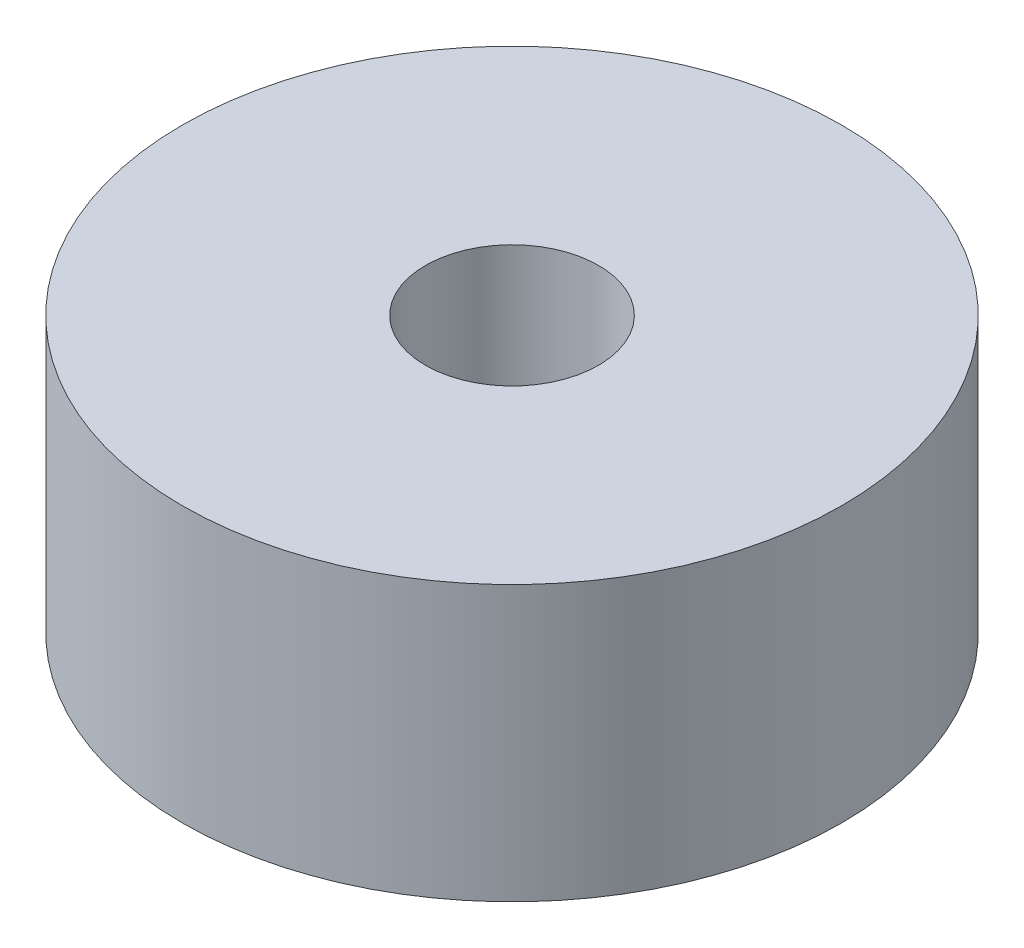
ISO-10303-21;
HEADER;
FILE_DESCRIPTION(('STEP AP214'),'2;1');
FILE_NAME('part.step','',(''),(''),'','','');
FILE_SCHEMA(('AUTOMOTIVE_DESIGN { 1 0 10303 214 1 1 1 1 }'));
ENDSEC;
DATA;
#1=APPLICATION_CONTEXT('core data for automotive mechanical design processes');
#2=APPLICATION_PROTOCOL_DEFINITION('international standard','automotive_design',2000,#1);
#3=PRODUCT_CONTEXT('',#1,'mechanical');
#4=PRODUCT('Part','Part','',(#3));
#5=PRODUCT_RELATED_PRODUCT_CATEGORY('part','',(#4));
#6=PRODUCT_DEFINITION_FORMATION('','',#4);
#7=PRODUCT_DEFINITION_CONTEXT('part definition',#1,'design');
#8=PRODUCT_DEFINITION('design','',#6,#7);
#9=PRODUCT_DEFINITION_SHAPE('','',#8);
#10=(LENGTH_UNIT() NAMED_UNIT(*) SI_UNIT(.MILLI.,.METRE.));
#11=(NAMED_UNIT(*) PLANE_ANGLE_UNIT() SI_UNIT($,.RADIAN.));
#12=(NAMED_UNIT(*) SI_UNIT($,.STERADIAN.) SOLID_ANGLE_UNIT());
#13=UNCERTAINTY_MEASURE_WITH_UNIT(LENGTH_MEASURE(1.E-05),#10,'distance_accuracy_value','');
#14=(GEOMETRIC_REPRESENTATION_CONTEXT(3) GLOBAL_UNCERTAINTY_ASSIGNED_CONTEXT((#13)) GLOBAL_UNIT_ASSIGNED_CONTEXT((#10,
#11,#12)) REPRESENTATION_CONTEXT('',''));
#15=CARTESIAN_POINT('',(0.,0.,0.));
#16=DIRECTION('',(0.,0.,1.));
#17=DIRECTION('',(1.,0.,0.));
#18=AXIS2_PLACEMENT_3D('',#15,#16,#17);
#19=CARTESIAN_POINT('',(0.,3.175,0.));
#20=DIRECTION('',(0.,-1.,0.));
#21=DIRECTION('',(0.,0.,-1.));
#22=AXIS2_PLACEMENT_3D('',#19,#20,#21);
#23=CYLINDRICAL_SURFACE('',#22,3.81);
#24=CARTESIAN_POINT('',(0.,3.175,0.));
#25=DIRECTION('',(0.,1.,0.));
#26=DIRECTION('',(0.,0.,1.));
#27=AXIS2_PLACEMENT_3D('',#24,#25,#26);
#28=CIRCLE('',#27,3.81);
#29=CARTESIAN_POINT('',(0.,3.175,3.81));
#30=VERTEX_POINT('',#29);
#31=EDGE_CURVE('E10',#30,#30,#28,.T.);
#32=ORIENTED_EDGE('',*,*,#31,.F.);
#33=EDGE_LOOP('',(#32));
#34=FACE_BOUND('',#33,.T.);
#35=CARTESIAN_POINT('',(0.,0.,0.));
#36=DIRECTION('',(0.,1.,0.));
#37=DIRECTION('',(0.,0.,1.));
#38=AXIS2_PLACEMENT_3D('',#35,#36,#37);
#39=CIRCLE('',#38,3.81);
#40=CARTESIAN_POINT('',(0.,0.,3.81));
#41=VERTEX_POINT('',#40);
#42=EDGE_CURVE('E40',#41,#41,#39,.T.);
#43=ORIENTED_EDGE('',*,*,#42,.T.);
#44=EDGE_LOOP('',(#43));
#45=FACE_BOUND('',#44,.T.);
#46=ADVANCED_FACE('F37',(#34,#45),#23,.T.);
#47=CARTESIAN_POINT('',(0.,3.175,0.));
#48=DIRECTION('',(0.,1.,0.));
#49=DIRECTION('',(0.,0.,1.));
#50=AXIS2_PLACEMENT_3D('',#47,#48,#49);
#51=PLANE('',#50);
#52=CARTESIAN_POINT('',(0.,3.175,0.));
#53=DIRECTION('',(0.,1.,0.));
#54=DIRECTION('',(0.,0.,1.));
#55=AXIS2_PLACEMENT_3D('',#52,#53,#54);
#56=CIRCLE('',#55,1.);
#57=CARTESIAN_POINT('',(0.,3.175,1.));
#58=VERTEX_POINT('',#57);
#59=EDGE_CURVE('E51',#58,#58,#56,.T.);
#60=ORIENTED_EDGE('',*,*,#59,.F.);
#61=EDGE_LOOP('',(#60));
#62=FACE_BOUND('',#61,.T.);
#63=ORIENTED_EDGE('',*,*,#31,.T.);
#64=EDGE_LOOP('',(#63));
#65=FACE_BOUND('',#64,.T.);
#66=ADVANCED_FACE('F68',(#62,#65),#51,.T.);
#67=CARTESIAN_POINT('',(0.,0.,0.));
#68=DIRECTION('',(0.,1.,0.));
#69=DIRECTION('',(0.,0.,1.));
#70=AXIS2_PLACEMENT_3D('',#67,#68,#69);
#71=PLANE('',#70);
#72=CARTESIAN_POINT('',(0.,0.,0.));
#73=DIRECTION('',(0.,1.,0.));
#74=DIRECTION('',(0.,0.,1.));
#75=AXIS2_PLACEMENT_3D('',#72,#73,#74);
#76=CIRCLE('',#75,1.);
#77=CARTESIAN_POINT('',(0.,0.,1.));
#78=VERTEX_POINT('',#77);
#79=EDGE_CURVE('E49',#78,#78,#76,.T.);
#80=ORIENTED_EDGE('',*,*,#79,.T.);
#81=EDGE_LOOP('',(#80));
#82=FACE_BOUND('',#81,.T.);
#83=ORIENTED_EDGE('',*,*,#42,.F.);
#84=EDGE_LOOP('',(#83));
#85=FACE_BOUND('',#84,.T.);
#86=ADVANCED_FACE('F59',(#82,#85),#71,.F.);
#87=CARTESIAN_POINT('',(0.,0.,0.));
#88=DIRECTION('',(0.,1.,0.));
#89=DIRECTION('',(0.,0.,1.));
#90=AXIS2_PLACEMENT_3D('',#87,#88,#89);
#91=CYLINDRICAL_SURFACE('',#90,1.);
#92=ORIENTED_EDGE('',*,*,#79,.F.);
#93=EDGE_LOOP('',(#92));
#94=FACE_BOUND('',#93,.T.);
#95=ORIENTED_EDGE('',*,*,#59,.T.);
#96=EDGE_LOOP('',(#95));
#97=FACE_BOUND('',#96,.T.);
#98=ADVANCED_FACE('F62',(#94,#97),#91,.F.);
#99=CLOSED_SHELL('',(#46,#66,#86,#98));
#100=MANIFOLD_SOLID_BREP('B2',#99);
#101=ADVANCED_BREP_SHAPE_REPRESENTATION('',(#18,#100),#14);
#102=SHAPE_DEFINITION_REPRESENTATION(#9,#101);
ENDSEC;
END-ISO-10303-21;
